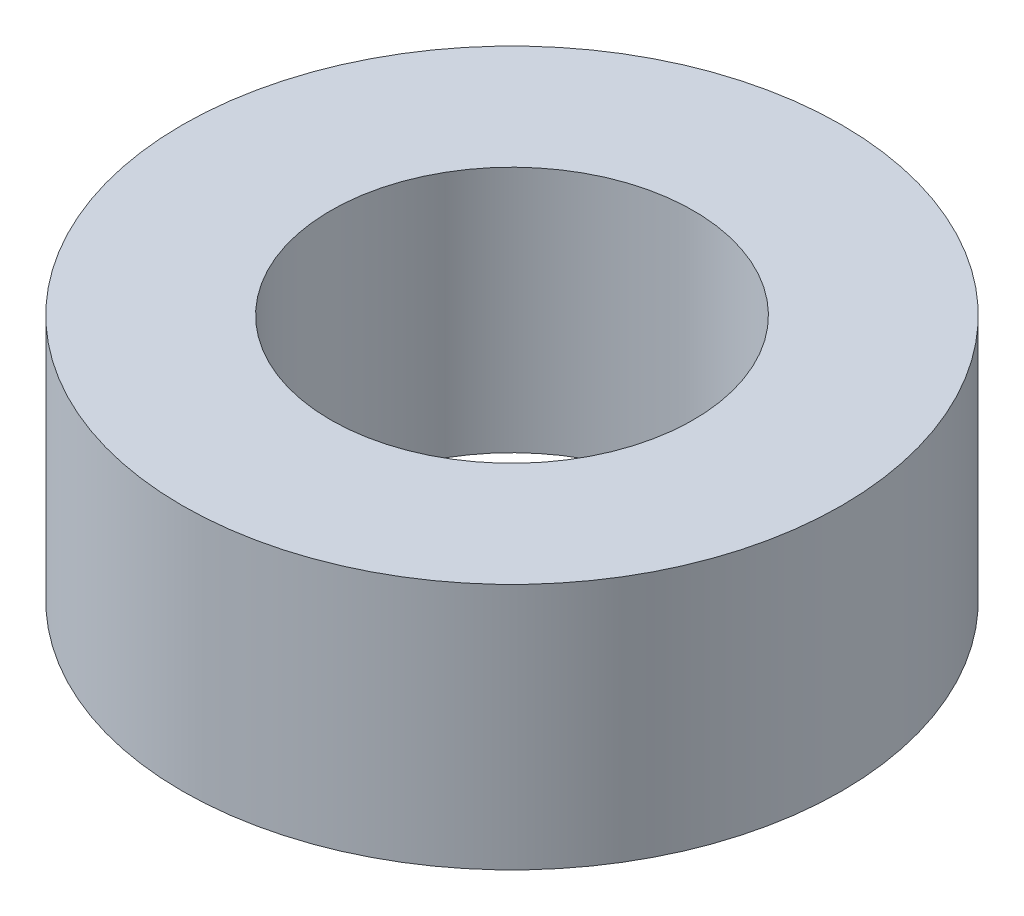
ISO-10303-21;
HEADER;
FILE_DESCRIPTION(('STEP AP214'),'2;1');
FILE_NAME('part.step','',(''),(''),'','','');
FILE_SCHEMA(('AUTOMOTIVE_DESIGN { 1 0 10303 214 1 1 1 1 }'));
ENDSEC;
DATA;
#1=APPLICATION_CONTEXT('core data for automotive mechanical design processes');
#2=APPLICATION_PROTOCOL_DEFINITION('international standard','automotive_design',2000,#1);
#3=PRODUCT_CONTEXT('',#1,'mechanical');
#4=PRODUCT('Part','Part','',(#3));
#5=PRODUCT_RELATED_PRODUCT_CATEGORY('part','',(#4));
#6=PRODUCT_DEFINITION_FORMATION('','',#4);
#7=PRODUCT_DEFINITION_CONTEXT('part definition',#1,'design');
#8=PRODUCT_DEFINITION('design','',#6,#7);
#9=PRODUCT_DEFINITION_SHAPE('','',#8);
#10=(LENGTH_UNIT() NAMED_UNIT(*) SI_UNIT(.MILLI.,.METRE.));
#11=(NAMED_UNIT(*) PLANE_ANGLE_UNIT() SI_UNIT($,.RADIAN.));
#12=(NAMED_UNIT(*) SI_UNIT($,.STERADIAN.) SOLID_ANGLE_UNIT());
#13=UNCERTAINTY_MEASURE_WITH_UNIT(LENGTH_MEASURE(1.E-05),#10,'distance_accuracy_value','');
#14=(GEOMETRIC_REPRESENTATION_CONTEXT(3) GLOBAL_UNCERTAINTY_ASSIGNED_CONTEXT((#13)) GLOBAL_UNIT_ASSIGNED_CONTEXT((#10,
#11,#12)) REPRESENTATION_CONTEXT('',''));
#15=CARTESIAN_POINT('',(0.,0.,0.));
#16=DIRECTION('',(0.,0.,1.));
#17=DIRECTION('',(1.,0.,0.));
#18=AXIS2_PLACEMENT_3D('',#15,#16,#17);
#19=CARTESIAN_POINT('',(0.,3.,0.));
#20=DIRECTION('',(0.,-1.,0.));
#21=DIRECTION('',(0.,0.,-1.));
#22=AXIS2_PLACEMENT_3D('',#19,#20,#21);
#23=CYLINDRICAL_SURFACE('',#22,4.);
#24=CARTESIAN_POINT('',(0.,3.,0.));
#25=DIRECTION('',(0.,1.,0.));
#26=DIRECTION('',(0.,0.,1.));
#27=AXIS2_PLACEMENT_3D('',#24,#25,#26);
#28=CIRCLE('',#27,4.);
#29=CARTESIAN_POINT('',(0.,3.,4.));
#30=VERTEX_POINT('',#29);
#31=EDGE_CURVE('E10',#30,#30,#28,.T.);
#32=ORIENTED_EDGE('',*,*,#31,.F.);
#33=EDGE_LOOP('',(#32));
#34=FACE_BOUND('',#33,.T.);
#35=CARTESIAN_POINT('',(0.,0.,0.));
#36=DIRECTION('',(0.,1.,0.));
#37=DIRECTION('',(0.,0.,1.));
#38=AXIS2_PLACEMENT_3D('',#35,#36,#37);
#39=CIRCLE('',#38,4.);
#40=CARTESIAN_POINT('',(0.,0.,4.));
#41=VERTEX_POINT('',#40);
#42=EDGE_CURVE('E46',#41,#41,#39,.T.);
#43=ORIENTED_EDGE('',*,*,#42,.T.);
#44=EDGE_LOOP('',(#43));
#45=FACE_BOUND('',#44,.T.);
#46=ADVANCED_FACE('F43',(#34,#45),#23,.T.);
#47=CARTESIAN_POINT('',(0.,3.,0.));
#48=DIRECTION('',(0.,1.,0.));
#49=DIRECTION('',(0.,0.,1.));
#50=AXIS2_PLACEMENT_3D('',#47,#48,#49);
#51=PLANE('',#50);
#52=CARTESIAN_POINT('',(0.,3.,0.));
#53=DIRECTION('',(0.,1.,0.));
#54=DIRECTION('',(0.,0.,1.));
#55=AXIS2_PLACEMENT_3D('',#52,#53,#54);
#56=CIRCLE('',#55,2.2);
#57=CARTESIAN_POINT('',(0.,3.,2.2));
#58=VERTEX_POINT('',#57);
#59=EDGE_CURVE('E57',#58,#58,#56,.T.);
#60=ORIENTED_EDGE('',*,*,#59,.F.);
#61=EDGE_LOOP('',(#60));
#62=FACE_BOUND('',#61,.T.);
#63=ORIENTED_EDGE('',*,*,#31,.T.);
#64=EDGE_LOOP('',(#63));
#65=FACE_BOUND('',#64,.T.);
#66=ADVANCED_FACE('F74',(#62,#65),#51,.T.);
#67=CARTESIAN_POINT('',(0.,0.,0.));
#68=DIRECTION('',(0.,1.,0.));
#69=DIRECTION('',(0.,0.,1.));
#70=AXIS2_PLACEMENT_3D('',#67,#68,#69);
#71=PLANE('',#70);
#72=CARTESIAN_POINT('',(0.,0.,0.));
#73=DIRECTION('',(0.,1.,0.));
#74=DIRECTION('',(0.,0.,1.));
#75=AXIS2_PLACEMENT_3D('',#72,#73,#74);
#76=CIRCLE('',#75,2.2);
#77=CARTESIAN_POINT('',(0.,0.,2.2));
#78=VERTEX_POINT('',#77);
#79=EDGE_CURVE('E55',#78,#78,#76,.T.);
#80=ORIENTED_EDGE('',*,*,#79,.T.);
#81=EDGE_LOOP('',(#80));
#82=FACE_BOUND('',#81,.T.);
#83=ORIENTED_EDGE('',*,*,#42,.F.);
#84=EDGE_LOOP('',(#83));
#85=FACE_BOUND('',#84,.T.);
#86=ADVANCED_FACE('F65',(#82,#85),#71,.F.);
#87=CARTESIAN_POINT('',(0.,0.,0.));
#88=DIRECTION('',(0.,1.,0.));
#89=DIRECTION('',(0.,0.,1.));
#90=AXIS2_PLACEMENT_3D('',#87,#88,#89);
#91=CYLINDRICAL_SURFACE('',#90,2.2);
#92=ORIENTED_EDGE('',*,*,#79,.F.);
#93=EDGE_LOOP('',(#92));
#94=FACE_BOUND('',#93,.T.);
#95=ORIENTED_EDGE('',*,*,#59,.T.);
#96=EDGE_LOOP('',(#95));
#97=FACE_BOUND('',#96,.T.);
#98=ADVANCED_FACE('F68',(#94,#97),#91,.F.);
#99=CLOSED_SHELL('',(#46,#66,#86,#98));
#100=MANIFOLD_SOLID_BREP('B2',#99);
#101=ADVANCED_BREP_SHAPE_REPRESENTATION('',(#18,#100),#14);
#102=SHAPE_DEFINITION_REPRESENTATION(#9,#101);
ENDSEC;
END-ISO-10303-21;
